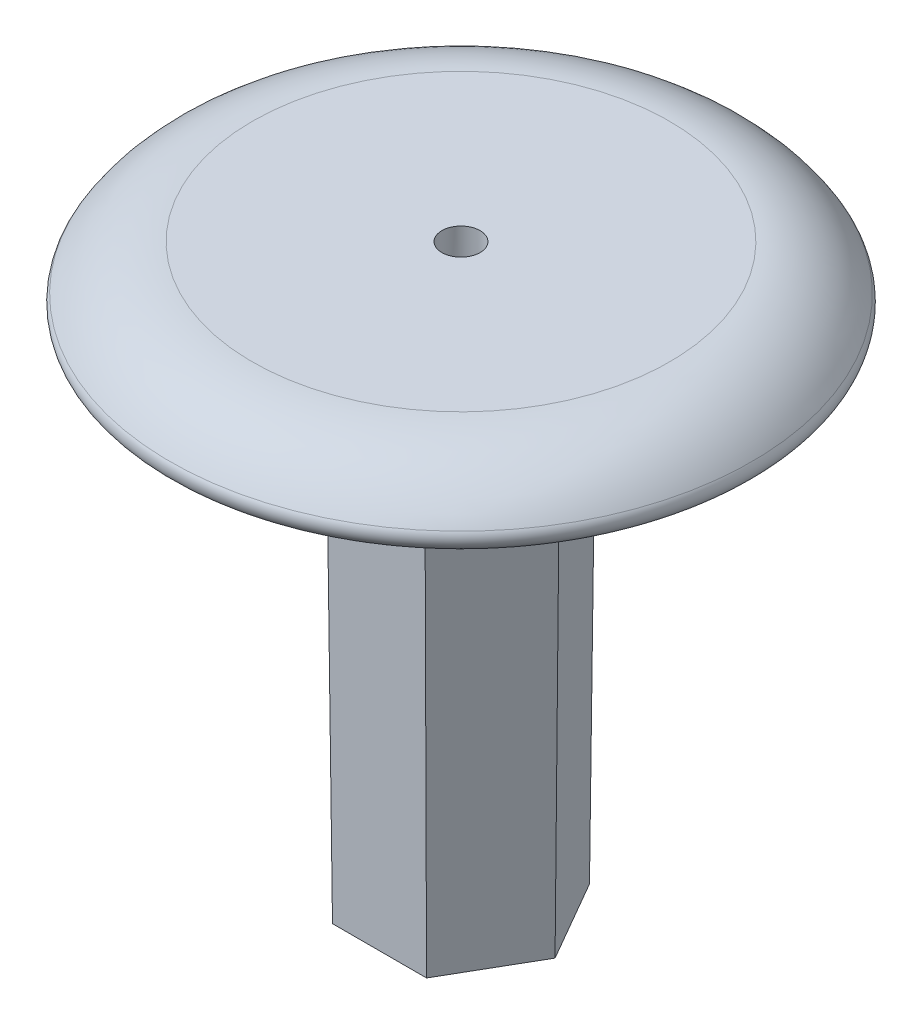
ISO-10303-21;
HEADER;
FILE_DESCRIPTION(('STEP AP214'),'2;1');
FILE_NAME('part.step','',(''),(''),'','','');
FILE_SCHEMA(('AUTOMOTIVE_DESIGN { 1 0 10303 214 1 1 1 1 }'));
ENDSEC;
DATA;
#1=APPLICATION_CONTEXT('core data for automotive mechanical design processes');
#2=APPLICATION_PROTOCOL_DEFINITION('international standard','automotive_design',2000,#1);
#3=PRODUCT_CONTEXT('',#1,'mechanical');
#4=PRODUCT('Part','Part','',(#3));
#5=PRODUCT_RELATED_PRODUCT_CATEGORY('part','',(#4));
#6=PRODUCT_DEFINITION_FORMATION('','',#4);
#7=PRODUCT_DEFINITION_CONTEXT('part definition',#1,'design');
#8=PRODUCT_DEFINITION('design','',#6,#7);
#9=PRODUCT_DEFINITION_SHAPE('','',#8);
#10=(LENGTH_UNIT() NAMED_UNIT(*) SI_UNIT(.MILLI.,.METRE.));
#11=(NAMED_UNIT(*) PLANE_ANGLE_UNIT() SI_UNIT($,.RADIAN.));
#12=(NAMED_UNIT(*) SI_UNIT($,.STERADIAN.) SOLID_ANGLE_UNIT());
#13=UNCERTAINTY_MEASURE_WITH_UNIT(LENGTH_MEASURE(1.E-05),#10,'distance_accuracy_value','');
#14=(GEOMETRIC_REPRESENTATION_CONTEXT(3) GLOBAL_UNCERTAINTY_ASSIGNED_CONTEXT((#13)) GLOBAL_UNIT_ASSIGNED_CONTEXT((#10,
#11,#12)) REPRESENTATION_CONTEXT('',''));
#15=CARTESIAN_POINT('',(0.,0.,0.));
#16=DIRECTION('',(0.,0.,1.));
#17=DIRECTION('',(1.,0.,0.));
#18=AXIS2_PLACEMENT_3D('',#15,#16,#17);
#19=CARTESIAN_POINT('',(0.,0.,0.));
#20=DIRECTION('',(0.,1.,0.));
#21=DIRECTION('',(-1.,0.,0.));
#22=AXIS2_PLACEMENT_3D('',#19,#20,#21);
#23=PLANE('',#22);
#24=DIRECTION('',(-1.,0.,0.));
#25=VECTOR('',#24,1.);
#26=CARTESIAN_POINT('',(-1.93290906366058,0.,-4.60686194212614));
#27=LINE('',#26,#25);
#28=CARTESIAN_POINT('',(2.65977298240597,0.,-4.60686194212614));
#29=VERTEX_POINT('',#28);
#30=CARTESIAN_POINT('',(-2.65977298240597,0.,-4.60686194212614));
#31=VERTEX_POINT('',#30);
#32=EDGE_CURVE('E169',#29,#31,#27,.T.);
#33=ORIENTED_EDGE('',*,*,#32,.T.);
#34=DIRECTION('',(-0.5,0.,0.866025403784438));
#35=VECTOR('',#34,1.);
#36=CARTESIAN_POINT('',(-4.95611400543924,0.,-0.629482618727811));
#37=LINE('',#36,#35);
#38=CARTESIAN_POINT('',(-5.31954596481193,0.,0.));
#39=VERTEX_POINT('',#38);
#40=EDGE_CURVE('E171',#31,#39,#37,.T.);
#41=ORIENTED_EDGE('',*,*,#40,.T.);
#42=DIRECTION('',(0.5,0.,0.866025403784439));
#43=VECTOR('',#42,1.);
#44=CARTESIAN_POINT('',(-3.98965947360895,0.,2.30343097106307));
#45=LINE('',#44,#43);
#46=CARTESIAN_POINT('',(-2.65977298240597,0.,4.60686194212613));
#47=VERTEX_POINT('',#46);
#48=EDGE_CURVE('E161',#39,#47,#45,.T.);
#49=ORIENTED_EDGE('',*,*,#48,.T.);
#50=DIRECTION('',(1.,0.,0.));
#51=VECTOR('',#50,1.);
#52=CARTESIAN_POINT('',(0.,0.,4.60686194212613));
#53=LINE('',#52,#51);
#54=CARTESIAN_POINT('',(2.65977298240597,0.,4.60686194212613));
#55=VERTEX_POINT('',#54);
#56=EDGE_CURVE('E163',#47,#55,#53,.T.);
#57=ORIENTED_EDGE('',*,*,#56,.T.);
#58=DIRECTION('',(0.5,0.,-0.866025403784439));
#59=VECTOR('',#58,1.);
#60=CARTESIAN_POINT('',(4.95611400543924,0.,0.629482618727812));
#61=LINE('',#60,#59);
#62=CARTESIAN_POINT('',(5.31954596481193,0.,0.));
#63=VERTEX_POINT('',#62);
#64=EDGE_CURVE('E165',#55,#63,#61,.T.);
#65=ORIENTED_EDGE('',*,*,#64,.T.);
#66=DIRECTION('',(-0.5,0.,-0.866025403784439));
#67=VECTOR('',#66,1.);
#68=CARTESIAN_POINT('',(3.98965947360895,0.,-2.30343097106307));
#69=LINE('',#68,#67);
#70=EDGE_CURVE('E167',#63,#29,#69,.T.);
#71=ORIENTED_EDGE('',*,*,#70,.T.);
#72=EDGE_LOOP('',(#33,#41,#49,#57,#65,#71));
#73=FACE_BOUND('',#72,.T.);
#74=CARTESIAN_POINT('',(0.,0.,0.));
#75=DIRECTION('',(0.,1.,0.));
#76=DIRECTION('',(-1.,0.,0.));
#77=AXIS2_PLACEMENT_3D('',#74,#75,#76);
#78=CIRCLE('',#77,10.9104305921262);
#79=CARTESIAN_POINT('',(-10.9104305921262,0.,0.));
#80=VERTEX_POINT('',#79);
#81=EDGE_CURVE('E144',#80,#80,#78,.T.);
#82=ORIENTED_EDGE('',*,*,#81,.F.);
#83=EDGE_LOOP('',(#82));
#84=FACE_BOUND('',#83,.T.);
#85=ADVANCED_FACE('F34',(#73,#84),#23,.F.);
#86=CARTESIAN_POINT('',(0.,0.507999999999991,0.));
#87=DIRECTION('',(0.,1.,0.));
#88=DIRECTION('',(-1.,0.,0.));
#89=AXIS2_PLACEMENT_3D('',#86,#87,#88);
#90=TOROIDAL_SURFACE('',#89,10.9104305921262,0.508);
#91=CARTESIAN_POINT('',(0.,0.781538461538456,0.));
#92=DIRECTION('',(0.,1.,0.));
#93=DIRECTION('',(-1.,0.,0.));
#94=AXIS2_PLACEMENT_3D('',#91,#92,#93);
#95=CIRCLE('',#94,11.3384968370687);
#96=CARTESIAN_POINT('',(-11.3384968370687,0.781538461538443,0.));
#97=VERTEX_POINT('',#96);
#98=EDGE_CURVE('E141',#97,#97,#95,.T.);
#99=ORIENTED_EDGE('',*,*,#98,.F.);
#100=EDGE_LOOP('',(#99));
#101=FACE_BOUND('',#100,.T.);
#102=ORIENTED_EDGE('',*,*,#81,.T.);
#103=EDGE_LOOP('',(#102));
#104=FACE_BOUND('',#103,.T.);
#105=ADVANCED_FACE('F215',(#101,#104),#90,.T.);
#106=CARTESIAN_POINT('',(0.,-1.27000000000002,0.));
#107=DIRECTION('',(0.,1.,0.));
#108=DIRECTION('',(-1.,0.,0.));
#109=AXIS2_PLACEMENT_3D('',#106,#107,#108);
#110=TOROIDAL_SURFACE('',#109,8.12799999999999,3.81);
#111=CARTESIAN_POINT('',(0.,2.53999999999999,0.));
#112=DIRECTION('',(0.,1.,0.));
#113=DIRECTION('',(-1.,0.,0.));
#114=AXIS2_PLACEMENT_3D('',#111,#112,#113);
#115=CIRCLE('',#114,8.128);
#116=CARTESIAN_POINT('',(-8.128,2.53999999999998,0.));
#117=VERTEX_POINT('',#116);
#118=EDGE_CURVE('E138',#117,#117,#115,.T.);
#119=ORIENTED_EDGE('',*,*,#118,.F.);
#120=EDGE_LOOP('',(#119));
#121=FACE_BOUND('',#120,.T.);
#122=ORIENTED_EDGE('',*,*,#98,.T.);
#123=EDGE_LOOP('',(#122));
#124=FACE_BOUND('',#123,.T.);
#125=ADVANCED_FACE('F221',(#121,#124),#110,.T.);
#126=CARTESIAN_POINT('',(8.12799999999999,2.54,0.));
#127=DIRECTION('',(0.,-1.,0.));
#128=DIRECTION('',(1.,0.,0.));
#129=AXIS2_PLACEMENT_3D('',#126,#127,#128);
#130=PLANE('',#129);
#131=CARTESIAN_POINT('',(0.,2.54000000000001,0.));
#132=DIRECTION('',(0.,-1.,0.));
#133=DIRECTION('',(1.,0.,0.));
#134=AXIS2_PLACEMENT_3D('',#131,#132,#133);
#135=CIRCLE('',#134,0.743450960320452);
#136=CARTESIAN_POINT('',(0.743450960320449,2.54000000000001,0.));
#137=VERTEX_POINT('',#136);
#138=EDGE_CURVE('E125',#137,#137,#135,.T.);
#139=ORIENTED_EDGE('',*,*,#138,.T.);
#140=EDGE_LOOP('',(#139));
#141=FACE_BOUND('',#140,.T.);
#142=ORIENTED_EDGE('',*,*,#118,.T.);
#143=EDGE_LOOP('',(#142));
#144=FACE_BOUND('',#143,.T.);
#145=ADVANCED_FACE('F229',(#141,#144),#130,.F.);
#146=CARTESIAN_POINT('',(-1.83308710467704,-19.812,3.175));
#147=DIRECTION('',(0.,-0.00872653549837395,0.999961923064171));
#148=DIRECTION('',(0.,-0.999961923064171,-0.00872653549837396));
#149=AXIS2_PLACEMENT_3D('',#146,#147,#148);
#150=PLANE('',#149);
#151=DIRECTION('',(-0.00503820367424841,-0.999949231718764,-0.0087264247426805));
#152=VECTOR('',#151,1.);
#153=CARTESIAN_POINT('',(1.83299404435774,-19.8304699946345,3.17483881479873));
#154=LINE('',#153,#152);
#155=CARTESIAN_POINT('',(1.83308710467708,-19.812,3.175));
#156=VERTEX_POINT('',#155);
#157=CARTESIAN_POINT('',(1.92656605987116,-1.25891729991707,3.33691029983464));
#158=VERTEX_POINT('',#157);
#159=EDGE_CURVE('E117',#156,#158,#154,.F.);
#160=ORIENTED_EDGE('',*,*,#159,.T.);
#161=DIRECTION('',(1.,0.,0.));
#162=VECTOR('',#161,1.);
#163=CARTESIAN_POINT('',(-1.83308710467706,-1.25891729991707,3.33691029983464));
#164=LINE('',#163,#162);
#165=CARTESIAN_POINT('',(-1.92656605987116,-1.25891729991707,3.33691029983464));
#166=VERTEX_POINT('',#165);
#167=EDGE_CURVE('E43',#158,#166,#164,.F.);
#168=ORIENTED_EDGE('',*,*,#167,.T.);
#169=DIRECTION('',(-0.00503820367425078,0.999949231718764,0.0087264247426805));
#170=VECTOR('',#169,1.);
#171=CARTESIAN_POINT('',(-1.8329940443577,-19.8304699946345,3.17483881479873));
#172=LINE('',#171,#170);
#173=CARTESIAN_POINT('',(-1.83308710467704,-19.812,3.175));
#174=VERTEX_POINT('',#173);
#175=EDGE_CURVE('E124',#174,#166,#172,.T.);
#176=ORIENTED_EDGE('',*,*,#175,.F.);
#177=DIRECTION('',(1.,0.,0.));
#178=VECTOR('',#177,1.);
#179=CARTESIAN_POINT('',(-1.83308710467704,-19.812,3.175));
#180=LINE('',#179,#178);
#181=EDGE_CURVE('E112',#174,#156,#180,.T.);
#182=ORIENTED_EDGE('',*,*,#181,.T.);
#183=EDGE_LOOP('',(#160,#168,#176,#182));
#184=FACE_BOUND('',#183,.T.);
#185=ADVANCED_FACE('F123',(#184),#150,.T.);
#186=CARTESIAN_POINT('',(-3.6661742093541,-19.812,0.));
#187=DIRECTION('',(-0.865992428190713,-0.00872653549837498,0.499980961532085));
#188=DIRECTION('',(0.5,0.,0.866025403784439));
#189=AXIS2_PLACEMENT_3D('',#186,#187,#188);
#190=PLANE('',#189);
#191=ORIENTED_EDGE('',*,*,#175,.T.);
#192=DIRECTION('',(0.5,0.,0.866025403784439));
#193=VECTOR('',#192,1.);
#194=CARTESIAN_POINT('',(-3.80639264214527,-1.25891729991708,0.0809551499173194));
#195=LINE('',#194,#193);
#196=CARTESIAN_POINT('',(-3.85313211974232,-1.25891729991707,0.));
#197=VERTEX_POINT('',#196);
#198=EDGE_CURVE('E11',#166,#197,#195,.F.);
#199=ORIENTED_EDGE('',*,*,#198,.T.);
#200=DIRECTION('',(0.0100764073485004,-0.999949231718764,0.));
#201=VECTOR('',#200,1.);
#202=CARTESIAN_POINT('',(-3.6661742093541,-19.812,0.));
#203=LINE('',#202,#201);
#204=CARTESIAN_POINT('',(-3.6661742093541,-19.812,0.));
#205=VERTEX_POINT('',#204);
#206=EDGE_CURVE('E148',#205,#197,#203,.F.);
#207=ORIENTED_EDGE('',*,*,#206,.F.);
#208=DIRECTION('',(0.5,0.,0.866025403784439));
#209=VECTOR('',#208,1.);
#210=CARTESIAN_POINT('',(-3.6661742093541,-19.812,0.));
#211=LINE('',#210,#209);
#212=EDGE_CURVE('E121',#205,#174,#211,.T.);
#213=ORIENTED_EDGE('',*,*,#212,.T.);
#214=EDGE_LOOP('',(#191,#199,#207,#213));
#215=FACE_BOUND('',#214,.T.);
#216=ADVANCED_FACE('F228',(#215),#190,.T.);
#217=CARTESIAN_POINT('',(-3.6661742093541,-19.812,0.));
#218=DIRECTION('',(-0.865992428190713,-0.00872653549837498,-0.499980961532086));
#219=DIRECTION('',(-0.5,0.,0.866025403784438));
#220=AXIS2_PLACEMENT_3D('',#217,#218,#219);
#221=PLANE('',#220);
#222=ORIENTED_EDGE('',*,*,#206,.T.);
#223=DIRECTION('',(0.5,0.,-0.866025403784439));
#224=VECTOR('',#223,1.);
#225=CARTESIAN_POINT('',(-1.92339455797645,-1.25891729991708,-3.34240350225257));
#226=LINE('',#225,#224);
#227=CARTESIAN_POINT('',(-1.92656605987116,-1.25891729991707,-3.33691029983464));
#228=VERTEX_POINT('',#227);
#229=EDGE_CURVE('E147',#197,#228,#226,.T.);
#230=ORIENTED_EDGE('',*,*,#229,.T.);
#231=DIRECTION('',(-0.00503820367425078,0.999949231718764,-0.0087264247426805));
#232=VECTOR('',#231,1.);
#233=CARTESIAN_POINT('',(-1.83308710467704,-19.812,-3.175));
#234=LINE('',#233,#232);
#235=CARTESIAN_POINT('',(-1.83308710467704,-19.812,-3.175));
#236=VERTEX_POINT('',#235);
#237=EDGE_CURVE('E154',#236,#228,#234,.T.);
#238=ORIENTED_EDGE('',*,*,#237,.F.);
#239=DIRECTION('',(0.5,0.,-0.866025403784438));
#240=VECTOR('',#239,1.);
#241=CARTESIAN_POINT('',(-3.6661742093541,-19.812,0.));
#242=LINE('',#241,#240);
#243=EDGE_CURVE('E135',#205,#236,#242,.T.);
#244=ORIENTED_EDGE('',*,*,#243,.F.);
#245=EDGE_LOOP('',(#222,#230,#238,#244));
#246=FACE_BOUND('',#245,.T.);
#247=ADVANCED_FACE('F237',(#246),#221,.T.);
#248=CARTESIAN_POINT('',(-1.83308710467704,-19.812,-3.175));
#249=DIRECTION('',(0.,-0.00872653549837395,-0.999961923064171));
#250=DIRECTION('',(0.,0.999961923064171,-0.00872653549837395));
#251=AXIS2_PLACEMENT_3D('',#248,#249,#250);
#252=PLANE('',#251);
#253=ORIENTED_EDGE('',*,*,#237,.T.);
#254=DIRECTION('',(1.,0.,0.));
#255=VECTOR('',#254,1.);
#256=CARTESIAN_POINT('',(1.93290906366058,-1.25891729991707,-3.33691029983464));
#257=LINE('',#256,#255);
#258=CARTESIAN_POINT('',(1.92656605987116,-1.25891729991707,-3.33691029983464));
#259=VERTEX_POINT('',#258);
#260=EDGE_CURVE('E174',#228,#259,#257,.T.);
#261=ORIENTED_EDGE('',*,*,#260,.T.);
#262=DIRECTION('',(-0.00503820367424842,-0.999949231718764,0.0087264247426805));
#263=VECTOR('',#262,1.);
#264=CARTESIAN_POINT('',(1.83299404435774,-19.8304699946345,-3.17483881479873));
#265=LINE('',#264,#263);
#266=CARTESIAN_POINT('',(1.83308710467708,-19.812,-3.175));
#267=VERTEX_POINT('',#266);
#268=EDGE_CURVE('E151',#267,#259,#265,.F.);
#269=ORIENTED_EDGE('',*,*,#268,.F.);
#270=DIRECTION('',(1.,0.,0.));
#271=VECTOR('',#270,1.);
#272=CARTESIAN_POINT('',(-1.83308710467704,-19.812,-3.175));
#273=LINE('',#272,#271);
#274=EDGE_CURVE('E133',#236,#267,#273,.T.);
#275=ORIENTED_EDGE('',*,*,#274,.F.);
#276=EDGE_LOOP('',(#253,#261,#269,#275));
#277=FACE_BOUND('',#276,.T.);
#278=ADVANCED_FACE('F233',(#277),#252,.T.);
#279=CARTESIAN_POINT('',(3.66617420935415,-19.812,0.));
#280=DIRECTION('',(0.865992428190713,-0.00872653549837293,-0.499980961532085));
#281=DIRECTION('',(-0.5,0.,-0.866025403784439));
#282=AXIS2_PLACEMENT_3D('',#279,#280,#281);
#283=PLANE('',#282);
#284=ORIENTED_EDGE('',*,*,#268,.T.);
#285=DIRECTION('',(-0.5,0.,-0.866025403784439));
#286=VECTOR('',#285,1.);
#287=CARTESIAN_POINT('',(3.80639264214528,-1.25891729991707,-0.0809551499173179));
#288=LINE('',#287,#286);
#289=CARTESIAN_POINT('',(3.85313211974233,-1.25891729991707,0.));
#290=VERTEX_POINT('',#289);
#291=EDGE_CURVE('E176',#259,#290,#288,.F.);
#292=ORIENTED_EDGE('',*,*,#291,.T.);
#293=DIRECTION('',(-0.010076407348498,-0.999949231718764,0.));
#294=VECTOR('',#293,1.);
#295=CARTESIAN_POINT('',(3.66617420935415,-19.812,0.));
#296=LINE('',#295,#294);
#297=CARTESIAN_POINT('',(3.66617420935415,-19.812,0.));
#298=VERTEX_POINT('',#297);
#299=EDGE_CURVE('E120',#298,#290,#296,.F.);
#300=ORIENTED_EDGE('',*,*,#299,.F.);
#301=DIRECTION('',(-0.5,0.,-0.866025403784439));
#302=VECTOR('',#301,1.);
#303=CARTESIAN_POINT('',(3.66617420935415,-19.812,0.));
#304=LINE('',#303,#302);
#305=EDGE_CURVE('E115',#298,#267,#304,.T.);
#306=ORIENTED_EDGE('',*,*,#305,.T.);
#307=EDGE_LOOP('',(#284,#292,#300,#306));
#308=FACE_BOUND('',#307,.T.);
#309=ADVANCED_FACE('F211',(#308),#283,.T.);
#310=CARTESIAN_POINT('',(3.66617420935415,-19.812,0.));
#311=DIRECTION('',(0.865992428190713,-0.00872653549837293,0.499980961532086));
#312=DIRECTION('',(0.5,0.,-0.866025403784439));
#313=AXIS2_PLACEMENT_3D('',#310,#311,#312);
#314=PLANE('',#313);
#315=ORIENTED_EDGE('',*,*,#299,.T.);
#316=DIRECTION('',(-0.5,0.,0.866025403784439));
#317=VECTOR('',#316,1.);
#318=CARTESIAN_POINT('',(1.92339455797645,-1.25891729991707,3.34240350225258));
#319=LINE('',#318,#317);
#320=EDGE_CURVE('E58',#290,#158,#319,.T.);
#321=ORIENTED_EDGE('',*,*,#320,.T.);
#322=ORIENTED_EDGE('',*,*,#159,.F.);
#323=DIRECTION('',(-0.5,0.,0.866025403784439));
#324=VECTOR('',#323,1.);
#325=CARTESIAN_POINT('',(3.66617420935415,-19.812,0.));
#326=LINE('',#325,#324);
#327=EDGE_CURVE('E108',#298,#156,#326,.T.);
#328=ORIENTED_EDGE('',*,*,#327,.F.);
#329=EDGE_LOOP('',(#315,#321,#322,#328));
#330=FACE_BOUND('',#329,.T.);
#331=ADVANCED_FACE('F118',(#330),#314,.T.);
#332=CARTESIAN_POINT('',(5.49926131403121,-19.812,3.175));
#333=DIRECTION('',(0.,1.,0.));
#334=DIRECTION('',(-1.,0.,0.));
#335=AXIS2_PLACEMENT_3D('',#332,#333,#334);
#336=PLANE('',#335);
#337=CARTESIAN_POINT('',(0.,-19.812,0.));
#338=DIRECTION('',(0.,-1.,0.));
#339=DIRECTION('',(1.,0.,0.));
#340=AXIS2_PLACEMENT_3D('',#337,#338,#339);
#341=CIRCLE('',#340,1.524);
#342=CARTESIAN_POINT('',(1.52400000000002,-19.812,0.));
#343=VERTEX_POINT('',#342);
#344=EDGE_CURVE('E128',#343,#343,#341,.T.);
#345=ORIENTED_EDGE('',*,*,#344,.F.);
#346=EDGE_LOOP('',(#345));
#347=FACE_BOUND('',#346,.T.);
#348=ORIENTED_EDGE('',*,*,#181,.F.);
#349=ORIENTED_EDGE('',*,*,#212,.F.);
#350=ORIENTED_EDGE('',*,*,#243,.T.);
#351=ORIENTED_EDGE('',*,*,#274,.T.);
#352=ORIENTED_EDGE('',*,*,#305,.F.);
#353=ORIENTED_EDGE('',*,*,#327,.T.);
#354=EDGE_LOOP('',(#348,#349,#350,#351,#352,#353));
#355=FACE_BOUND('',#354,.T.);
#356=ADVANCED_FACE('F109',(#347,#355),#336,.F.);
#357=CARTESIAN_POINT('',(0.,-19.812,0.));
#358=DIRECTION('',(0.,-1.,0.));
#359=DIRECTION('',(1.,0.,0.));
#360=AXIS2_PLACEMENT_3D('',#357,#358,#359);
#361=CONICAL_SURFACE('',#360,1.524,0.0349065850398867);
#362=ORIENTED_EDGE('',*,*,#138,.F.);
#363=EDGE_LOOP('',(#362));
#364=FACE_BOUND('',#363,.T.);
#365=ORIENTED_EDGE('',*,*,#344,.T.);
#366=EDGE_LOOP('',(#365));
#367=FACE_BOUND('',#366,.T.);
#368=ADVANCED_FACE('F201',(#364,#367),#361,.F.);
#369=CARTESIAN_POINT('',(4.90620302594748,-1.27,0.715930971063068));
#370=DIRECTION('',(-0.5,0.,0.866025403784439));
#371=DIRECTION('',(0.866025403784439,0.,0.5));
#372=AXIS2_PLACEMENT_3D('',#369,#370,#371);
#373=CYLINDRICAL_SURFACE('',#372,1.27);
#374=CARTESIAN_POINT('',(5.31954596481193,-1.27,0.));
#375=DIRECTION('',(0.,0.,1.));
#376=DIRECTION('',(-1.,0.,0.));
#377=AXIS2_PLACEMENT_3D('',#374,#375,#376);
#378=ELLIPSE('',#377,1.46646968374165,1.27);
#379=EDGE_CURVE('E189',#63,#290,#378,.T.);
#380=ORIENTED_EDGE('',*,*,#379,.F.);
#381=ORIENTED_EDGE('',*,*,#64,.F.);
#382=CARTESIAN_POINT('',(2.65977298240597,-1.27,4.60686194212613));
#383=DIRECTION('',(0.866025403784439,0.,-0.5));
#384=DIRECTION('',(0.5,0.,0.866025403784439));
#385=AXIS2_PLACEMENT_3D('',#382,#383,#384);
#386=ELLIPSE('',#385,1.46646968374165,1.27);
#387=EDGE_CURVE('E38',#158,#55,#386,.T.);
#388=ORIENTED_EDGE('',*,*,#387,.F.);
#389=ORIENTED_EDGE('',*,*,#320,.F.);
#390=EDGE_LOOP('',(#380,#381,#388,#389));
#391=FACE_BOUND('',#390,.T.);
#392=ADVANCED_FACE('F36',(#391),#373,.F.);
#393=CARTESIAN_POINT('',(0.,-1.27000000000001,4.60686194212613));
#394=DIRECTION('',(1.,0.,0.));
#395=DIRECTION('',(0.,1.,0.));
#396=AXIS2_PLACEMENT_3D('',#393,#394,#395);
#397=CYLINDRICAL_SURFACE('',#396,1.27);
#398=ORIENTED_EDGE('',*,*,#387,.T.);
#399=ORIENTED_EDGE('',*,*,#56,.F.);
#400=CARTESIAN_POINT('',(-2.65977298240596,-1.27000000000001,4.60686194212614));
#401=DIRECTION('',(0.866025403784439,0.,0.5));
#402=DIRECTION('',(-0.5,0.,0.866025403784439));
#403=AXIS2_PLACEMENT_3D('',#400,#401,#402);
#404=ELLIPSE('',#403,1.46646968374165,1.27);
#405=EDGE_CURVE('E187',#166,#47,#404,.T.);
#406=ORIENTED_EDGE('',*,*,#405,.F.);
#407=ORIENTED_EDGE('',*,*,#167,.F.);
#408=EDGE_LOOP('',(#398,#399,#406,#407));
#409=FACE_BOUND('',#408,.T.);
#410=ADVANCED_FACE('F259',(#409),#397,.F.);
#411=CARTESIAN_POINT('',(3.98965947360895,-1.27,-2.30343097106307));
#412=DIRECTION('',(-0.5,0.,-0.866025403784439));
#413=DIRECTION('',(-0.866025403784439,0.,0.5));
#414=AXIS2_PLACEMENT_3D('',#411,#412,#413);
#415=CYLINDRICAL_SURFACE('',#414,1.27);
#416=ORIENTED_EDGE('',*,*,#379,.T.);
#417=ORIENTED_EDGE('',*,*,#291,.F.);
#418=CARTESIAN_POINT('',(2.65977298240597,-1.27,-4.60686194212614));
#419=DIRECTION('',(-0.866025403784439,0.,-0.5));
#420=DIRECTION('',(0.5,0.,-0.866025403784439));
#421=AXIS2_PLACEMENT_3D('',#418,#419,#420);
#422=ELLIPSE('',#421,1.46646968374165,1.27);
#423=EDGE_CURVE('E184',#29,#259,#422,.F.);
#424=ORIENTED_EDGE('',*,*,#423,.F.);
#425=ORIENTED_EDGE('',*,*,#70,.F.);
#426=EDGE_LOOP('',(#416,#417,#424,#425));
#427=FACE_BOUND('',#426,.T.);
#428=ADVANCED_FACE('F256',(#427),#415,.F.);
#429=CARTESIAN_POINT('',(-3.98965947360895,-1.27000000000001,2.30343097106307));
#430=DIRECTION('',(0.5,0.,0.866025403784439));
#431=DIRECTION('',(0.866025403784439,0.,-0.5));
#432=AXIS2_PLACEMENT_3D('',#429,#430,#431);
#433=CYLINDRICAL_SURFACE('',#432,1.27);
#434=ORIENTED_EDGE('',*,*,#405,.T.);
#435=ORIENTED_EDGE('',*,*,#48,.F.);
#436=CARTESIAN_POINT('',(-5.31954596481193,-1.27000000000001,0.));
#437=DIRECTION('',(0.,0.,1.));
#438=DIRECTION('',(1.,0.,0.));
#439=AXIS2_PLACEMENT_3D('',#436,#437,#438);
#440=ELLIPSE('',#439,1.46646968374165,1.27);
#441=EDGE_CURVE('E182',#197,#39,#440,.T.);
#442=ORIENTED_EDGE('',*,*,#441,.F.);
#443=ORIENTED_EDGE('',*,*,#198,.F.);
#444=EDGE_LOOP('',(#434,#435,#442,#443));
#445=FACE_BOUND('',#444,.T.);
#446=ADVANCED_FACE('F252',(#445),#433,.F.);
#447=CARTESIAN_POINT('',(-1.83308710467706,-1.27000000000001,-4.60686194212614));
#448=DIRECTION('',(1.,0.,0.));
#449=DIRECTION('',(0.,1.,0.));
#450=AXIS2_PLACEMENT_3D('',#447,#448,#449);
#451=CYLINDRICAL_SURFACE('',#450,1.27);
#452=ORIENTED_EDGE('',*,*,#423,.T.);
#453=ORIENTED_EDGE('',*,*,#260,.F.);
#454=CARTESIAN_POINT('',(-2.65977298240597,-1.27000000000001,-4.60686194212613));
#455=DIRECTION('',(0.866025403784439,0.,-0.5));
#456=DIRECTION('',(0.5,0.,0.866025403784439));
#457=AXIS2_PLACEMENT_3D('',#454,#455,#456);
#458=ELLIPSE('',#457,1.46646968374165,1.27);
#459=EDGE_CURVE('E180',#31,#228,#458,.T.);
#460=ORIENTED_EDGE('',*,*,#459,.F.);
#461=ORIENTED_EDGE('',*,*,#32,.F.);
#462=EDGE_LOOP('',(#452,#453,#460,#461));
#463=FACE_BOUND('',#462,.T.);
#464=ADVANCED_FACE('F248',(#463),#451,.F.);
#465=CARTESIAN_POINT('',(-4.90620302594748,-1.27000000000001,-0.715930971063069));
#466=DIRECTION('',(0.5,0.,-0.866025403784438));
#467=DIRECTION('',(-0.866025403784439,0.,-0.5));
#468=AXIS2_PLACEMENT_3D('',#465,#466,#467);
#469=CYLINDRICAL_SURFACE('',#468,1.27);
#470=ORIENTED_EDGE('',*,*,#441,.T.);
#471=ORIENTED_EDGE('',*,*,#40,.F.);
#472=ORIENTED_EDGE('',*,*,#459,.T.);
#473=ORIENTED_EDGE('',*,*,#229,.F.);
#474=EDGE_LOOP('',(#470,#471,#472,#473));
#475=FACE_BOUND('',#474,.T.);
#476=ADVANCED_FACE('F245',(#475),#469,.F.);
#477=CLOSED_SHELL('',(#85,#105,#125,#145,#185,#216,#247,#278,#309,#331,#356,#368,#392,#410,#428,
#446,#464,#476));
#478=MANIFOLD_SOLID_BREP('B2',#477);
#479=ADVANCED_BREP_SHAPE_REPRESENTATION('',(#18,#478),#14);
#480=SHAPE_DEFINITION_REPRESENTATION(#9,#479);
ENDSEC;
END-ISO-10303-21;
